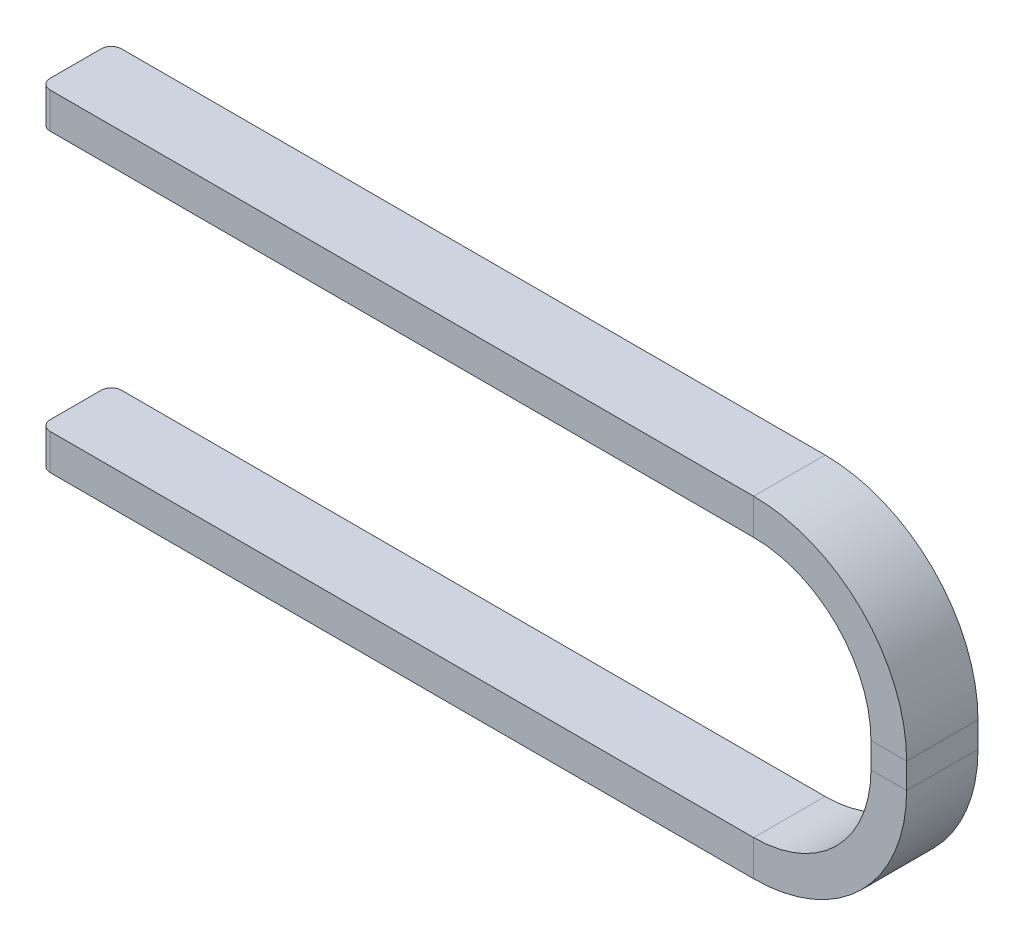
ISO-10303-21;
HEADER;
FILE_DESCRIPTION(('STEP AP214'),'2;1');
FILE_NAME('part.step','',(''),(''),'','','');
FILE_SCHEMA(('AUTOMOTIVE_DESIGN { 1 0 10303 214 1 1 1 1 }'));
ENDSEC;
DATA;
#1=APPLICATION_CONTEXT('core data for automotive mechanical design processes');
#2=APPLICATION_PROTOCOL_DEFINITION('international standard','automotive_design',2000,#1);
#3=PRODUCT_CONTEXT('',#1,'mechanical');
#4=PRODUCT('Part','Part','',(#3));
#5=PRODUCT_RELATED_PRODUCT_CATEGORY('part','',(#4));
#6=PRODUCT_DEFINITION_FORMATION('','',#4);
#7=PRODUCT_DEFINITION_CONTEXT('part definition',#1,'design');
#8=PRODUCT_DEFINITION('design','',#6,#7);
#9=PRODUCT_DEFINITION_SHAPE('','',#8);
#10=(LENGTH_UNIT() NAMED_UNIT(*) SI_UNIT(.MILLI.,.METRE.));
#11=(NAMED_UNIT(*) PLANE_ANGLE_UNIT() SI_UNIT($,.RADIAN.));
#12=(NAMED_UNIT(*) SI_UNIT($,.STERADIAN.) SOLID_ANGLE_UNIT());
#13=UNCERTAINTY_MEASURE_WITH_UNIT(LENGTH_MEASURE(1.E-05),#10,'distance_accuracy_value','');
#14=(GEOMETRIC_REPRESENTATION_CONTEXT(3) GLOBAL_UNCERTAINTY_ASSIGNED_CONTEXT((#13)) GLOBAL_UNIT_ASSIGNED_CONTEXT((#10,
#11,#12)) REPRESENTATION_CONTEXT('',''));
#15=CARTESIAN_POINT('',(0.,0.,0.));
#16=DIRECTION('',(0.,0.,1.));
#17=DIRECTION('',(1.,0.,0.));
#18=AXIS2_PLACEMENT_3D('',#15,#16,#17);
#19=CARTESIAN_POINT('',(17.,-3.00000000000002,1.4));
#20=DIRECTION('',(0.,0.,1.));
#21=DIRECTION('',(1.,0.,0.));
#22=AXIS2_PLACEMENT_3D('',#19,#20,#21);
#23=PLANE('',#22);
#24=DIRECTION('',(-1.,0.,0.));
#25=VECTOR('',#24,1.);
#26=CARTESIAN_POINT('',(17.,-3.00000000000002,1.4));
#27=LINE('',#26,#25);
#28=CARTESIAN_POINT('',(17.,-3.00000000000002,1.4));
#29=VERTEX_POINT('',#28);
#30=CARTESIAN_POINT('',(16.3,-3.00000000000002,1.4));
#31=VERTEX_POINT('',#30);
#32=EDGE_CURVE('E274',#29,#31,#27,.T.);
#33=ORIENTED_EDGE('',*,*,#32,.F.);
#34=CARTESIAN_POINT('',(14.,-3.,1.4));
#35=DIRECTION('',(0.,0.,-1.));
#36=DIRECTION('',(1.,0.,0.));
#37=AXIS2_PLACEMENT_3D('',#34,#35,#36);
#38=CIRCLE('',#37,3.);
#39=CARTESIAN_POINT('',(14.,0.,1.4));
#40=VERTEX_POINT('',#39);
#41=EDGE_CURVE('E193',#40,#29,#38,.T.);
#42=ORIENTED_EDGE('',*,*,#41,.F.);
#43=DIRECTION('',(0.,1.,0.));
#44=VECTOR('',#43,1.);
#45=CARTESIAN_POINT('',(14.,-0.700000000000001,1.4));
#46=LINE('',#45,#44);
#47=CARTESIAN_POINT('',(14.,-0.700000000000001,1.4));
#48=VERTEX_POINT('',#47);
#49=EDGE_CURVE('E271',#48,#40,#46,.T.);
#50=ORIENTED_EDGE('',*,*,#49,.F.);
#51=CARTESIAN_POINT('',(14.,-3.,1.4));
#52=DIRECTION('',(0.,0.,1.));
#53=DIRECTION('',(1.,0.,0.));
#54=AXIS2_PLACEMENT_3D('',#51,#52,#53);
#55=CIRCLE('',#54,2.3);
#56=EDGE_CURVE('E203',#48,#31,#55,.F.);
#57=ORIENTED_EDGE('',*,*,#56,.T.);
#58=EDGE_LOOP('',(#33,#42,#50,#57));
#59=FACE_BOUND('',#58,.T.);
#60=ADVANCED_FACE('F37',(#59),#23,.T.);
#61=CARTESIAN_POINT('',(14.,-0.700000000000001,1.4));
#62=DIRECTION('',(0.,0.,1.));
#63=DIRECTION('',(1.,0.,0.));
#64=AXIS2_PLACEMENT_3D('',#61,#62,#63);
#65=PLANE('',#64);
#66=DIRECTION('',(0.,-1.,0.));
#67=VECTOR('',#66,1.);
#68=CARTESIAN_POINT('',(17.,-3.00000000000002,1.4));
#69=LINE('',#68,#67);
#70=CARTESIAN_POINT('',(17.,-3.49999999999998,1.4));
#71=VERTEX_POINT('',#70);
#72=EDGE_CURVE('E191',#29,#71,#69,.T.);
#73=ORIENTED_EDGE('',*,*,#72,.F.);
#74=ORIENTED_EDGE('',*,*,#32,.T.);
#75=DIRECTION('',(0.,1.,0.));
#76=VECTOR('',#75,1.);
#77=CARTESIAN_POINT('',(16.3,-3.00000000000002,1.4));
#78=LINE('',#77,#76);
#79=CARTESIAN_POINT('',(16.3,-3.49999999999998,1.4));
#80=VERTEX_POINT('',#79);
#81=EDGE_CURVE('E206',#31,#80,#78,.F.);
#82=ORIENTED_EDGE('',*,*,#81,.T.);
#83=DIRECTION('',(1.,0.,0.));
#84=VECTOR('',#83,1.);
#85=CARTESIAN_POINT('',(16.3,-3.49999999999998,1.4));
#86=LINE('',#85,#84);
#87=EDGE_CURVE('E164',#80,#71,#86,.T.);
#88=ORIENTED_EDGE('',*,*,#87,.T.);
#89=EDGE_LOOP('',(#73,#74,#82,#88));
#90=FACE_BOUND('',#89,.T.);
#91=ADVANCED_FACE('F340',(#90),#65,.T.);
#92=CARTESIAN_POINT('',(14.,0.,0.));
#93=DIRECTION('',(0.,0.,-1.));
#94=DIRECTION('',(-1.,0.,0.));
#95=AXIS2_PLACEMENT_3D('',#92,#93,#94);
#96=PLANE('',#95);
#97=DIRECTION('',(0.,-1.,0.));
#98=VECTOR('',#97,1.);
#99=CARTESIAN_POINT('',(14.,0.,0.));
#100=LINE('',#99,#98);
#101=CARTESIAN_POINT('',(14.,0.,0.));
#102=VERTEX_POINT('',#101);
#103=CARTESIAN_POINT('',(14.,-0.700000000000001,0.));
#104=VERTEX_POINT('',#103);
#105=EDGE_CURVE('E268',#102,#104,#100,.T.);
#106=ORIENTED_EDGE('',*,*,#105,.F.);
#107=CARTESIAN_POINT('',(14.,-3.,0.));
#108=DIRECTION('',(0.,0.,-1.));
#109=DIRECTION('',(1.,0.,0.));
#110=AXIS2_PLACEMENT_3D('',#107,#108,#109);
#111=CIRCLE('',#110,3.);
#112=CARTESIAN_POINT('',(17.,-3.00000000000002,0.));
#113=VERTEX_POINT('',#112);
#114=EDGE_CURVE('E220',#102,#113,#111,.T.);
#115=ORIENTED_EDGE('',*,*,#114,.T.);
#116=DIRECTION('',(1.,0.,0.));
#117=VECTOR('',#116,1.);
#118=CARTESIAN_POINT('',(16.3,-3.00000000000002,0.));
#119=LINE('',#118,#117);
#120=CARTESIAN_POINT('',(16.3,-3.00000000000002,0.));
#121=VERTEX_POINT('',#120);
#122=EDGE_CURVE('E163',#121,#113,#119,.T.);
#123=ORIENTED_EDGE('',*,*,#122,.F.);
#124=CARTESIAN_POINT('',(14.,-3.,0.));
#125=DIRECTION('',(0.,0.,1.));
#126=DIRECTION('',(1.,0.,0.));
#127=AXIS2_PLACEMENT_3D('',#124,#125,#126);
#128=CIRCLE('',#127,2.3);
#129=EDGE_CURVE('E227',#104,#121,#128,.F.);
#130=ORIENTED_EDGE('',*,*,#129,.F.);
#131=EDGE_LOOP('',(#106,#115,#123,#130));
#132=FACE_BOUND('',#131,.T.);
#133=ADVANCED_FACE('F373',(#132),#96,.T.);
#134=CARTESIAN_POINT('',(16.3,-3.00000000000002,0.));
#135=DIRECTION('',(0.,0.,-1.));
#136=DIRECTION('',(-1.,0.,0.));
#137=AXIS2_PLACEMENT_3D('',#134,#135,#136);
#138=PLANE('',#137);
#139=DIRECTION('',(1.,0.,0.));
#140=VECTOR('',#139,1.);
#141=CARTESIAN_POINT('',(0.,-0.7,0.));
#142=LINE('',#141,#140);
#143=CARTESIAN_POINT('',(0.199999999999999,-0.7,0.));
#144=VERTEX_POINT('',#143);
#145=EDGE_CURVE('E225',#144,#104,#142,.T.);
#146=ORIENTED_EDGE('',*,*,#145,.F.);
#147=DIRECTION('',(0.,1.,0.));
#148=VECTOR('',#147,1.);
#149=CARTESIAN_POINT('',(0.199999999999999,-3.00000000000002,0.));
#150=LINE('',#149,#148);
#151=CARTESIAN_POINT('',(0.199999999999999,0.,0.));
#152=VERTEX_POINT('',#151);
#153=EDGE_CURVE('E293',#144,#152,#150,.T.);
#154=ORIENTED_EDGE('',*,*,#153,.T.);
#155=DIRECTION('',(1.,0.,0.));
#156=VECTOR('',#155,1.);
#157=CARTESIAN_POINT('',(0.,0.,0.));
#158=LINE('',#157,#156);
#159=EDGE_CURVE('E223',#152,#102,#158,.T.);
#160=ORIENTED_EDGE('',*,*,#159,.T.);
#161=ORIENTED_EDGE('',*,*,#105,.T.);
#162=EDGE_LOOP('',(#146,#154,#160,#161));
#163=FACE_BOUND('',#162,.T.);
#164=ADVANCED_FACE('F313',(#163),#138,.T.);
#165=CARTESIAN_POINT('',(14.,-6.5,1.4));
#166=DIRECTION('',(0.,0.,1.));
#167=DIRECTION('',(1.,0.,0.));
#168=AXIS2_PLACEMENT_3D('',#165,#166,#167);
#169=PLANE('',#168);
#170=DIRECTION('',(0.,1.,0.));
#171=VECTOR('',#170,1.);
#172=CARTESIAN_POINT('',(14.,-6.5,1.4));
#173=LINE('',#172,#171);
#174=CARTESIAN_POINT('',(14.,-6.5,1.4));
#175=VERTEX_POINT('',#174);
#176=CARTESIAN_POINT('',(14.,-5.8,1.4));
#177=VERTEX_POINT('',#176);
#178=EDGE_CURVE('E151',#175,#177,#173,.T.);
#179=ORIENTED_EDGE('',*,*,#178,.F.);
#180=CARTESIAN_POINT('',(14.,-3.5,1.4));
#181=DIRECTION('',(0.,0.,-1.));
#182=DIRECTION('',(1.,0.,0.));
#183=AXIS2_PLACEMENT_3D('',#180,#181,#182);
#184=CIRCLE('',#183,3.);
#185=EDGE_CURVE('E155',#71,#175,#184,.T.);
#186=ORIENTED_EDGE('',*,*,#185,.F.);
#187=ORIENTED_EDGE('',*,*,#87,.F.);
#188=CARTESIAN_POINT('',(14.,-3.5,1.4));
#189=DIRECTION('',(0.,0.,1.));
#190=DIRECTION('',(1.,0.,0.));
#191=AXIS2_PLACEMENT_3D('',#188,#189,#190);
#192=CIRCLE('',#191,2.3);
#193=EDGE_CURVE('E158',#80,#177,#192,.F.);
#194=ORIENTED_EDGE('',*,*,#193,.T.);
#195=EDGE_LOOP('',(#179,#186,#187,#194));
#196=FACE_BOUND('',#195,.T.);
#197=ADVANCED_FACE('F153',(#196),#169,.T.);
#198=CARTESIAN_POINT('',(16.3,-3.49999999999998,1.4));
#199=DIRECTION('',(0.,0.,1.));
#200=DIRECTION('',(1.,0.,0.));
#201=AXIS2_PLACEMENT_3D('',#198,#199,#200);
#202=PLANE('',#201);
#203=DIRECTION('',(-1.,0.,0.));
#204=VECTOR('',#203,1.);
#205=CARTESIAN_POINT('',(14.,-5.8,1.4));
#206=LINE('',#205,#204);
#207=CARTESIAN_POINT('',(0.200000000000001,-5.8,1.4));
#208=VERTEX_POINT('',#207);
#209=EDGE_CURVE('E186',#177,#208,#206,.T.);
#210=ORIENTED_EDGE('',*,*,#209,.T.);
#211=DIRECTION('',(0.,1.,0.));
#212=VECTOR('',#211,1.);
#213=CARTESIAN_POINT('',(0.199999999999999,-3.49999999999998,1.4));
#214=LINE('',#213,#212);
#215=CARTESIAN_POINT('',(0.200000000000001,-6.5,1.4));
#216=VERTEX_POINT('',#215);
#217=EDGE_CURVE('E185',#208,#216,#214,.F.);
#218=ORIENTED_EDGE('',*,*,#217,.T.);
#219=DIRECTION('',(-1.,0.,0.));
#220=VECTOR('',#219,1.);
#221=CARTESIAN_POINT('',(14.,-6.5,1.4));
#222=LINE('',#221,#220);
#223=EDGE_CURVE('E173',#175,#216,#222,.T.);
#224=ORIENTED_EDGE('',*,*,#223,.F.);
#225=ORIENTED_EDGE('',*,*,#178,.T.);
#226=EDGE_LOOP('',(#210,#218,#224,#225));
#227=FACE_BOUND('',#226,.T.);
#228=ADVANCED_FACE('F183',(#227),#202,.T.);
#229=CARTESIAN_POINT('',(17.,-3.49999999999998,0.));
#230=DIRECTION('',(0.,0.,-1.));
#231=DIRECTION('',(-1.,0.,0.));
#232=AXIS2_PLACEMENT_3D('',#229,#230,#231);
#233=PLANE('',#232);
#234=DIRECTION('',(-1.,0.,0.));
#235=VECTOR('',#234,1.);
#236=CARTESIAN_POINT('',(17.,-3.49999999999998,0.));
#237=LINE('',#236,#235);
#238=CARTESIAN_POINT('',(17.,-3.49999999999998,0.));
#239=VERTEX_POINT('',#238);
#240=CARTESIAN_POINT('',(16.3,-3.49999999999998,0.));
#241=VERTEX_POINT('',#240);
#242=EDGE_CURVE('E264',#239,#241,#237,.T.);
#243=ORIENTED_EDGE('',*,*,#242,.F.);
#244=CARTESIAN_POINT('',(14.,-3.5,0.));
#245=DIRECTION('',(0.,0.,-1.));
#246=DIRECTION('',(1.,0.,0.));
#247=AXIS2_PLACEMENT_3D('',#244,#245,#246);
#248=CIRCLE('',#247,3.);
#249=CARTESIAN_POINT('',(14.,-6.5,0.));
#250=VERTEX_POINT('',#249);
#251=EDGE_CURVE('E215',#239,#250,#248,.T.);
#252=ORIENTED_EDGE('',*,*,#251,.T.);
#253=DIRECTION('',(0.,-1.,0.));
#254=VECTOR('',#253,1.);
#255=CARTESIAN_POINT('',(14.,-5.8,0.));
#256=LINE('',#255,#254);
#257=CARTESIAN_POINT('',(14.,-5.8,0.));
#258=VERTEX_POINT('',#257);
#259=EDGE_CURVE('E262',#258,#250,#256,.T.);
#260=ORIENTED_EDGE('',*,*,#259,.F.);
#261=CARTESIAN_POINT('',(14.,-3.5,0.));
#262=DIRECTION('',(0.,0.,1.));
#263=DIRECTION('',(1.,0.,0.));
#264=AXIS2_PLACEMENT_3D('',#261,#262,#263);
#265=CIRCLE('',#264,2.3);
#266=EDGE_CURVE('E233',#241,#258,#265,.F.);
#267=ORIENTED_EDGE('',*,*,#266,.F.);
#268=EDGE_LOOP('',(#243,#252,#260,#267));
#269=FACE_BOUND('',#268,.T.);
#270=ADVANCED_FACE('F368',(#269),#233,.T.);
#271=CARTESIAN_POINT('',(14.,-5.8,0.));
#272=DIRECTION('',(0.,0.,-1.));
#273=DIRECTION('',(-1.,0.,0.));
#274=AXIS2_PLACEMENT_3D('',#271,#272,#273);
#275=PLANE('',#274);
#276=DIRECTION('',(0.,-1.,0.));
#277=VECTOR('',#276,1.);
#278=CARTESIAN_POINT('',(17.,-3.00000000000002,0.));
#279=LINE('',#278,#277);
#280=EDGE_CURVE('E217',#113,#239,#279,.T.);
#281=ORIENTED_EDGE('',*,*,#280,.T.);
#282=ORIENTED_EDGE('',*,*,#242,.T.);
#283=DIRECTION('',(0.,1.,0.));
#284=VECTOR('',#283,1.);
#285=CARTESIAN_POINT('',(16.3,-3.00000000000002,0.));
#286=LINE('',#285,#284);
#287=EDGE_CURVE('E230',#121,#241,#286,.F.);
#288=ORIENTED_EDGE('',*,*,#287,.F.);
#289=ORIENTED_EDGE('',*,*,#122,.T.);
#290=EDGE_LOOP('',(#281,#282,#288,#289));
#291=FACE_BOUND('',#290,.T.);
#292=ADVANCED_FACE('F370',(#291),#275,.T.);
#293=CARTESIAN_POINT('',(14.,-5.8,1.4));
#294=DIRECTION('',(0.,-1.,0.));
#295=DIRECTION('',(1.,0.,0.));
#296=AXIS2_PLACEMENT_3D('',#293,#294,#295);
#297=PLANE('',#296);
#298=DIRECTION('',(-1.,0.,0.));
#299=VECTOR('',#298,1.);
#300=CARTESIAN_POINT('',(14.,-5.8,0.));
#301=LINE('',#300,#299);
#302=CARTESIAN_POINT('',(0.200000000000001,-5.8,0.));
#303=VERTEX_POINT('',#302);
#304=EDGE_CURVE('E211',#258,#303,#301,.T.);
#305=ORIENTED_EDGE('',*,*,#304,.T.);
#306=CARTESIAN_POINT('',(0.200000000000001,-5.8,0.2));
#307=DIRECTION('',(0.,-1.,0.));
#308=DIRECTION('',(1.,0.,0.));
#309=AXIS2_PLACEMENT_3D('',#306,#307,#308);
#310=CIRCLE('',#309,0.2);
#311=CARTESIAN_POINT('',(0.,-5.8,0.2));
#312=VERTEX_POINT('',#311);
#313=EDGE_CURVE('E281',#303,#312,#310,.F.);
#314=ORIENTED_EDGE('',*,*,#313,.T.);
#315=DIRECTION('',(0.,0.,-1.));
#316=VECTOR('',#315,1.);
#317=CARTESIAN_POINT('',(0.,-5.8,1.4));
#318=LINE('',#317,#316);
#319=CARTESIAN_POINT('',(0.,-5.8,1.2));
#320=VERTEX_POINT('',#319);
#321=EDGE_CURVE('E259',#320,#312,#318,.T.);
#322=ORIENTED_EDGE('',*,*,#321,.F.);
#323=CARTESIAN_POINT('',(0.2,-5.8,1.2));
#324=DIRECTION('',(0.,-1.,0.));
#325=DIRECTION('',(1.,0.,0.));
#326=AXIS2_PLACEMENT_3D('',#323,#324,#325);
#327=CIRCLE('',#326,0.2);
#328=EDGE_CURVE('E279',#320,#208,#327,.F.);
#329=ORIENTED_EDGE('',*,*,#328,.T.);
#330=ORIENTED_EDGE('',*,*,#209,.F.);
#331=DIRECTION('',(0.,0.,-1.));
#332=VECTOR('',#331,1.);
#333=CARTESIAN_POINT('',(14.,-5.8,1.4));
#334=LINE('',#333,#332);
#335=EDGE_CURVE('E210',#177,#258,#334,.T.);
#336=ORIENTED_EDGE('',*,*,#335,.T.);
#337=EDGE_LOOP('',(#305,#314,#322,#329,#330,#336));
#338=FACE_BOUND('',#337,.T.);
#339=ADVANCED_FACE('F352',(#338),#297,.F.);
#340=CARTESIAN_POINT('',(0.,-6.5,1.4));
#341=DIRECTION('',(-1.,0.,0.));
#342=DIRECTION('',(0.,0.,1.));
#343=AXIS2_PLACEMENT_3D('',#340,#341,#342);
#344=PLANE('',#343);
#345=ORIENTED_EDGE('',*,*,#321,.T.);
#346=DIRECTION('',(0.,1.,0.));
#347=VECTOR('',#346,1.);
#348=CARTESIAN_POINT('',(0.,-6.5,0.2));
#349=LINE('',#348,#347);
#350=CARTESIAN_POINT('',(0.,-6.5,0.2));
#351=VERTEX_POINT('',#350);
#352=EDGE_CURVE('E286',#312,#351,#349,.F.);
#353=ORIENTED_EDGE('',*,*,#352,.T.);
#354=DIRECTION('',(0.,0.,-1.));
#355=VECTOR('',#354,1.);
#356=CARTESIAN_POINT('',(0.,-6.5,1.4));
#357=LINE('',#356,#355);
#358=CARTESIAN_POINT('',(0.,-6.5,1.2));
#359=VERTEX_POINT('',#358);
#360=EDGE_CURVE('E180',#359,#351,#357,.T.);
#361=ORIENTED_EDGE('',*,*,#360,.F.);
#362=DIRECTION('',(0.,1.,0.));
#363=VECTOR('',#362,1.);
#364=CARTESIAN_POINT('',(0.,-6.5,1.2));
#365=LINE('',#364,#363);
#366=EDGE_CURVE('E283',#359,#320,#365,.T.);
#367=ORIENTED_EDGE('',*,*,#366,.T.);
#368=EDGE_LOOP('',(#345,#353,#361,#367));
#369=FACE_BOUND('',#368,.T.);
#370=ADVANCED_FACE('F360',(#369),#344,.T.);
#371=CARTESIAN_POINT('',(14.,-6.5,1.4));
#372=DIRECTION('',(0.,-1.,0.));
#373=DIRECTION('',(1.,0.,0.));
#374=AXIS2_PLACEMENT_3D('',#371,#372,#373);
#375=PLANE('',#374);
#376=ORIENTED_EDGE('',*,*,#360,.T.);
#377=CARTESIAN_POINT('',(0.200000000000001,-6.5,0.2));
#378=DIRECTION('',(0.,-1.,0.));
#379=DIRECTION('',(1.,0.,0.));
#380=AXIS2_PLACEMENT_3D('',#377,#378,#379);
#381=CIRCLE('',#380,0.2);
#382=CARTESIAN_POINT('',(0.200000000000001,-6.5,0.));
#383=VERTEX_POINT('',#382);
#384=EDGE_CURVE('E290',#351,#383,#381,.T.);
#385=ORIENTED_EDGE('',*,*,#384,.T.);
#386=DIRECTION('',(-1.,0.,0.));
#387=VECTOR('',#386,1.);
#388=CARTESIAN_POINT('',(14.,-6.5,0.));
#389=LINE('',#388,#387);
#390=EDGE_CURVE('E176',#250,#383,#389,.T.);
#391=ORIENTED_EDGE('',*,*,#390,.F.);
#392=DIRECTION('',(0.,0.,-1.));
#393=VECTOR('',#392,1.);
#394=CARTESIAN_POINT('',(14.,-6.5,1.4));
#395=LINE('',#394,#393);
#396=EDGE_CURVE('E170',#175,#250,#395,.T.);
#397=ORIENTED_EDGE('',*,*,#396,.F.);
#398=ORIENTED_EDGE('',*,*,#223,.T.);
#399=CARTESIAN_POINT('',(0.2,-6.5,1.2));
#400=DIRECTION('',(0.,-1.,0.));
#401=DIRECTION('',(1.,0.,0.));
#402=AXIS2_PLACEMENT_3D('',#399,#400,#401);
#403=CIRCLE('',#402,0.2);
#404=EDGE_CURVE('E288',#216,#359,#403,.T.);
#405=ORIENTED_EDGE('',*,*,#404,.T.);
#406=EDGE_LOOP('',(#376,#385,#391,#397,#398,#405));
#407=FACE_BOUND('',#406,.T.);
#408=ADVANCED_FACE('F172',(#407),#375,.T.);
#409=CARTESIAN_POINT('',(14.,-3.5,1.4));
#410=DIRECTION('',(0.,0.,-1.));
#411=DIRECTION('',(-1.,0.,0.));
#412=AXIS2_PLACEMENT_3D('',#409,#410,#411);
#413=CYLINDRICAL_SURFACE('',#412,3.);
#414=ORIENTED_EDGE('',*,*,#251,.F.);
#415=DIRECTION('',(0.,0.,-1.));
#416=VECTOR('',#415,1.);
#417=CARTESIAN_POINT('',(17.,-3.49999999999998,1.4));
#418=LINE('',#417,#416);
#419=EDGE_CURVE('E181',#71,#239,#418,.T.);
#420=ORIENTED_EDGE('',*,*,#419,.F.);
#421=ORIENTED_EDGE('',*,*,#185,.T.);
#422=ORIENTED_EDGE('',*,*,#396,.T.);
#423=EDGE_LOOP('',(#414,#420,#421,#422));
#424=FACE_BOUND('',#423,.T.);
#425=ADVANCED_FACE('F189',(#424),#413,.T.);
#426=CARTESIAN_POINT('',(17.,-3.00000000000002,1.4));
#427=DIRECTION('',(1.,0.,0.));
#428=DIRECTION('',(0.,0.,-1.));
#429=AXIS2_PLACEMENT_3D('',#426,#427,#428);
#430=PLANE('',#429);
#431=ORIENTED_EDGE('',*,*,#280,.F.);
#432=DIRECTION('',(0.,0.,-1.));
#433=VECTOR('',#432,1.);
#434=CARTESIAN_POINT('',(17.,-3.00000000000002,1.4));
#435=LINE('',#434,#433);
#436=EDGE_CURVE('E254',#29,#113,#435,.T.);
#437=ORIENTED_EDGE('',*,*,#436,.F.);
#438=ORIENTED_EDGE('',*,*,#72,.T.);
#439=ORIENTED_EDGE('',*,*,#419,.T.);
#440=EDGE_LOOP('',(#431,#437,#438,#439));
#441=FACE_BOUND('',#440,.T.);
#442=ADVANCED_FACE('F339',(#441),#430,.T.);
#443=CARTESIAN_POINT('',(14.,-3.,1.4));
#444=DIRECTION('',(0.,0.,-1.));
#445=DIRECTION('',(-1.,0.,0.));
#446=AXIS2_PLACEMENT_3D('',#443,#444,#445);
#447=CYLINDRICAL_SURFACE('',#446,3.);
#448=ORIENTED_EDGE('',*,*,#114,.F.);
#449=DIRECTION('',(0.,0.,-1.));
#450=VECTOR('',#449,1.);
#451=CARTESIAN_POINT('',(14.,0.,1.4));
#452=LINE('',#451,#450);
#453=EDGE_CURVE('E251',#40,#102,#452,.T.);
#454=ORIENTED_EDGE('',*,*,#453,.F.);
#455=ORIENTED_EDGE('',*,*,#41,.T.);
#456=ORIENTED_EDGE('',*,*,#436,.T.);
#457=EDGE_LOOP('',(#448,#454,#455,#456));
#458=FACE_BOUND('',#457,.T.);
#459=ADVANCED_FACE('F331',(#458),#447,.T.);
#460=CARTESIAN_POINT('',(0.,0.,1.4));
#461=DIRECTION('',(0.,1.,0.));
#462=DIRECTION('',(0.,0.,1.));
#463=AXIS2_PLACEMENT_3D('',#460,#461,#462);
#464=PLANE('',#463);
#465=ORIENTED_EDGE('',*,*,#159,.F.);
#466=CARTESIAN_POINT('',(0.199999999999999,0.,0.2));
#467=DIRECTION('',(0.,1.,0.));
#468=DIRECTION('',(0.,0.,1.));
#469=AXIS2_PLACEMENT_3D('',#466,#467,#468);
#470=CIRCLE('',#469,0.2);
#471=CARTESIAN_POINT('',(0.,0.,0.2));
#472=VERTEX_POINT('',#471);
#473=EDGE_CURVE('E298',#152,#472,#470,.T.);
#474=ORIENTED_EDGE('',*,*,#473,.T.);
#475=DIRECTION('',(0.,0.,-1.));
#476=VECTOR('',#475,1.);
#477=CARTESIAN_POINT('',(0.,0.,1.4));
#478=LINE('',#477,#476);
#479=CARTESIAN_POINT('',(0.,0.,1.2));
#480=VERTEX_POINT('',#479);
#481=EDGE_CURVE('E249',#480,#472,#478,.T.);
#482=ORIENTED_EDGE('',*,*,#481,.F.);
#483=CARTESIAN_POINT('',(0.2,0.,1.2));
#484=DIRECTION('',(0.,1.,0.));
#485=DIRECTION('',(0.,0.,1.));
#486=AXIS2_PLACEMENT_3D('',#483,#484,#485);
#487=CIRCLE('',#486,0.2);
#488=CARTESIAN_POINT('',(0.2,0.,1.4));
#489=VERTEX_POINT('',#488);
#490=EDGE_CURVE('E296',#480,#489,#487,.T.);
#491=ORIENTED_EDGE('',*,*,#490,.T.);
#492=DIRECTION('',(1.,0.,0.));
#493=VECTOR('',#492,1.);
#494=CARTESIAN_POINT('',(0.,0.,1.4));
#495=LINE('',#494,#493);
#496=EDGE_CURVE('E199',#489,#40,#495,.T.);
#497=ORIENTED_EDGE('',*,*,#496,.T.);
#498=ORIENTED_EDGE('',*,*,#453,.T.);
#499=EDGE_LOOP('',(#465,#474,#482,#491,#497,#498));
#500=FACE_BOUND('',#499,.T.);
#501=ADVANCED_FACE('F319',(#500),#464,.T.);
#502=CARTESIAN_POINT('',(0.,-0.7,1.4));
#503=DIRECTION('',(-1.,0.,0.));
#504=DIRECTION('',(0.,0.,1.));
#505=AXIS2_PLACEMENT_3D('',#502,#503,#504);
#506=PLANE('',#505);
#507=ORIENTED_EDGE('',*,*,#481,.T.);
#508=DIRECTION('',(0.,1.,0.));
#509=VECTOR('',#508,1.);
#510=CARTESIAN_POINT('',(0.,-0.7,0.2));
#511=LINE('',#510,#509);
#512=CARTESIAN_POINT('',(0.,-0.7,0.2));
#513=VERTEX_POINT('',#512);
#514=EDGE_CURVE('E58',#472,#513,#511,.F.);
#515=ORIENTED_EDGE('',*,*,#514,.T.);
#516=DIRECTION('',(0.,0.,-1.));
#517=VECTOR('',#516,1.);
#518=CARTESIAN_POINT('',(0.,-0.7,1.4));
#519=LINE('',#518,#517);
#520=CARTESIAN_POINT('',(0.,-0.7,1.2));
#521=VERTEX_POINT('',#520);
#522=EDGE_CURVE('E247',#521,#513,#519,.T.);
#523=ORIENTED_EDGE('',*,*,#522,.F.);
#524=DIRECTION('',(0.,1.,0.));
#525=VECTOR('',#524,1.);
#526=CARTESIAN_POINT('',(0.,0.,1.2));
#527=LINE('',#526,#525);
#528=EDGE_CURVE('E300',#521,#480,#527,.T.);
#529=ORIENTED_EDGE('',*,*,#528,.T.);
#530=EDGE_LOOP('',(#507,#515,#523,#529));
#531=FACE_BOUND('',#530,.T.);
#532=ADVANCED_FACE('F320',(#531),#506,.T.);
#533=CARTESIAN_POINT('',(0.,-0.7,1.4));
#534=DIRECTION('',(0.,1.,0.));
#535=DIRECTION('',(0.,0.,1.));
#536=AXIS2_PLACEMENT_3D('',#533,#534,#535);
#537=PLANE('',#536);
#538=ORIENTED_EDGE('',*,*,#522,.T.);
#539=CARTESIAN_POINT('',(0.199999999999999,-0.7,0.2));
#540=DIRECTION('',(0.,1.,0.));
#541=DIRECTION('',(0.,0.,1.));
#542=AXIS2_PLACEMENT_3D('',#539,#540,#541);
#543=CIRCLE('',#542,0.2);
#544=EDGE_CURVE('E45',#513,#144,#543,.F.);
#545=ORIENTED_EDGE('',*,*,#544,.T.);
#546=ORIENTED_EDGE('',*,*,#145,.T.);
#547=DIRECTION('',(0.,0.,-1.));
#548=VECTOR('',#547,1.);
#549=CARTESIAN_POINT('',(14.,-0.700000000000001,1.4));
#550=LINE('',#549,#548);
#551=EDGE_CURVE('E244',#48,#104,#550,.T.);
#552=ORIENTED_EDGE('',*,*,#551,.F.);
#553=DIRECTION('',(1.,0.,0.));
#554=VECTOR('',#553,1.);
#555=CARTESIAN_POINT('',(0.,-0.7,1.4));
#556=LINE('',#555,#554);
#557=CARTESIAN_POINT('',(0.2,-0.7,1.4));
#558=VERTEX_POINT('',#557);
#559=EDGE_CURVE('E201',#558,#48,#556,.T.);
#560=ORIENTED_EDGE('',*,*,#559,.F.);
#561=CARTESIAN_POINT('',(0.2,-0.7,1.2));
#562=DIRECTION('',(0.,1.,0.));
#563=DIRECTION('',(0.,0.,1.));
#564=AXIS2_PLACEMENT_3D('',#561,#562,#563);
#565=CIRCLE('',#564,0.2);
#566=EDGE_CURVE('E304',#558,#521,#565,.F.);
#567=ORIENTED_EDGE('',*,*,#566,.T.);
#568=EDGE_LOOP('',(#538,#545,#546,#552,#560,#567));
#569=FACE_BOUND('',#568,.T.);
#570=ADVANCED_FACE('F308',(#569),#537,.F.);
#571=CARTESIAN_POINT('',(14.,-3.,1.4));
#572=DIRECTION('',(0.,0.,-1.));
#573=DIRECTION('',(-1.,0.,0.));
#574=AXIS2_PLACEMENT_3D('',#571,#572,#573);
#575=CYLINDRICAL_SURFACE('',#574,2.3);
#576=ORIENTED_EDGE('',*,*,#129,.T.);
#577=DIRECTION('',(0.,0.,-1.));
#578=VECTOR('',#577,1.);
#579=CARTESIAN_POINT('',(16.3,-3.00000000000002,1.4));
#580=LINE('',#579,#578);
#581=EDGE_CURVE('E241',#31,#121,#580,.T.);
#582=ORIENTED_EDGE('',*,*,#581,.F.);
#583=ORIENTED_EDGE('',*,*,#56,.F.);
#584=ORIENTED_EDGE('',*,*,#551,.T.);
#585=EDGE_LOOP('',(#576,#582,#583,#584));
#586=FACE_BOUND('',#585,.T.);
#587=ADVANCED_FACE('F375',(#586),#575,.F.);
#588=CARTESIAN_POINT('',(16.3,-3.00000000000002,1.4));
#589=DIRECTION('',(1.,0.,0.));
#590=DIRECTION('',(0.,0.,-1.));
#591=AXIS2_PLACEMENT_3D('',#588,#589,#590);
#592=PLANE('',#591);
#593=ORIENTED_EDGE('',*,*,#287,.T.);
#594=DIRECTION('',(0.,0.,-1.));
#595=VECTOR('',#594,1.);
#596=CARTESIAN_POINT('',(16.3,-3.49999999999998,1.4));
#597=LINE('',#596,#595);
#598=EDGE_CURVE('E238',#80,#241,#597,.T.);
#599=ORIENTED_EDGE('',*,*,#598,.F.);
#600=ORIENTED_EDGE('',*,*,#81,.F.);
#601=ORIENTED_EDGE('',*,*,#581,.T.);
#602=EDGE_LOOP('',(#593,#599,#600,#601));
#603=FACE_BOUND('',#602,.T.);
#604=ADVANCED_FACE('F344',(#603),#592,.F.);
#605=CARTESIAN_POINT('',(14.,-3.5,1.4));
#606=DIRECTION('',(0.,0.,-1.));
#607=DIRECTION('',(-1.,0.,0.));
#608=AXIS2_PLACEMENT_3D('',#605,#606,#607);
#609=CYLINDRICAL_SURFACE('',#608,2.3);
#610=ORIENTED_EDGE('',*,*,#266,.T.);
#611=ORIENTED_EDGE('',*,*,#335,.F.);
#612=ORIENTED_EDGE('',*,*,#193,.F.);
#613=ORIENTED_EDGE('',*,*,#598,.T.);
#614=EDGE_LOOP('',(#610,#611,#612,#613));
#615=FACE_BOUND('',#614,.T.);
#616=ADVANCED_FACE('F348',(#615),#609,.F.);
#617=CARTESIAN_POINT('',(14.,-3.5,1.4));
#618=DIRECTION('',(0.,0.,-1.));
#619=DIRECTION('',(-1.,0.,0.));
#620=AXIS2_PLACEMENT_3D('',#617,#618,#619);
#621=PLANE('',#620);
#622=ORIENTED_EDGE('',*,*,#496,.F.);
#623=DIRECTION('',(0.,1.,0.));
#624=VECTOR('',#623,1.);
#625=CARTESIAN_POINT('',(0.2,-0.7,1.4));
#626=LINE('',#625,#624);
#627=EDGE_CURVE('E11',#489,#558,#626,.F.);
#628=ORIENTED_EDGE('',*,*,#627,.T.);
#629=ORIENTED_EDGE('',*,*,#559,.T.);
#630=ORIENTED_EDGE('',*,*,#49,.T.);
#631=EDGE_LOOP('',(#622,#628,#629,#630));
#632=FACE_BOUND('',#631,.T.);
#633=ADVANCED_FACE('F324',(#632),#621,.F.);
#634=CARTESIAN_POINT('',(14.,-3.5,0.));
#635=DIRECTION('',(0.,0.,-1.));
#636=DIRECTION('',(-1.,0.,0.));
#637=AXIS2_PLACEMENT_3D('',#634,#635,#636);
#638=PLANE('',#637);
#639=ORIENTED_EDGE('',*,*,#390,.T.);
#640=DIRECTION('',(0.,1.,0.));
#641=VECTOR('',#640,1.);
#642=CARTESIAN_POINT('',(0.200000000000001,-3.5,0.));
#643=LINE('',#642,#641);
#644=EDGE_CURVE('E276',#383,#303,#643,.T.);
#645=ORIENTED_EDGE('',*,*,#644,.T.);
#646=ORIENTED_EDGE('',*,*,#304,.F.);
#647=ORIENTED_EDGE('',*,*,#259,.T.);
#648=EDGE_LOOP('',(#639,#645,#646,#647));
#649=FACE_BOUND('',#648,.T.);
#650=ADVANCED_FACE('F366',(#649),#638,.T.);
#651=CARTESIAN_POINT('',(0.200000000000001,-3.5,0.2));
#652=DIRECTION('',(0.,1.,0.));
#653=DIRECTION('',(0.,0.,1.));
#654=AXIS2_PLACEMENT_3D('',#651,#652,#653);
#655=CYLINDRICAL_SURFACE('',#654,0.2);
#656=ORIENTED_EDGE('',*,*,#384,.F.);
#657=ORIENTED_EDGE('',*,*,#352,.F.);
#658=ORIENTED_EDGE('',*,*,#313,.F.);
#659=ORIENTED_EDGE('',*,*,#644,.F.);
#660=EDGE_LOOP('',(#656,#657,#658,#659));
#661=FACE_BOUND('',#660,.T.);
#662=ADVANCED_FACE('F363',(#661),#655,.T.);
#663=CARTESIAN_POINT('',(0.2,-6.5,1.2));
#664=DIRECTION('',(0.,1.,0.));
#665=DIRECTION('',(0.,0.,1.));
#666=AXIS2_PLACEMENT_3D('',#663,#664,#665);
#667=CYLINDRICAL_SURFACE('',#666,0.2);
#668=ORIENTED_EDGE('',*,*,#404,.F.);
#669=ORIENTED_EDGE('',*,*,#217,.F.);
#670=ORIENTED_EDGE('',*,*,#328,.F.);
#671=ORIENTED_EDGE('',*,*,#366,.F.);
#672=EDGE_LOOP('',(#668,#669,#670,#671));
#673=FACE_BOUND('',#672,.T.);
#674=ADVANCED_FACE('F355',(#673),#667,.T.);
#675=CARTESIAN_POINT('',(0.199999999999999,-3.00000000000002,0.2));
#676=DIRECTION('',(0.,1.,0.));
#677=DIRECTION('',(0.,0.,1.));
#678=AXIS2_PLACEMENT_3D('',#675,#676,#677);
#679=CYLINDRICAL_SURFACE('',#678,0.2);
#680=ORIENTED_EDGE('',*,*,#544,.F.);
#681=ORIENTED_EDGE('',*,*,#514,.F.);
#682=ORIENTED_EDGE('',*,*,#473,.F.);
#683=ORIENTED_EDGE('',*,*,#153,.F.);
#684=EDGE_LOOP('',(#680,#681,#682,#683));
#685=FACE_BOUND('',#684,.T.);
#686=ADVANCED_FACE('F316',(#685),#679,.T.);
#687=CARTESIAN_POINT('',(0.2,-0.7,1.2));
#688=DIRECTION('',(0.,-1.,0.));
#689=DIRECTION('',(0.,0.,-1.));
#690=AXIS2_PLACEMENT_3D('',#687,#688,#689);
#691=CYLINDRICAL_SURFACE('',#690,0.2);
#692=ORIENTED_EDGE('',*,*,#566,.F.);
#693=ORIENTED_EDGE('',*,*,#627,.F.);
#694=ORIENTED_EDGE('',*,*,#490,.F.);
#695=ORIENTED_EDGE('',*,*,#528,.F.);
#696=EDGE_LOOP('',(#692,#693,#694,#695));
#697=FACE_BOUND('',#696,.T.);
#698=ADVANCED_FACE('F39',(#697),#691,.T.);
#699=CLOSED_SHELL('',(#60,#91,#133,#164,#197,#228,#270,#292,#339,#370,#408,#425,#442,#459,#501,
#532,#570,#587,#604,#616,#633,#650,#662,#674,#686,#698));
#700=MANIFOLD_SOLID_BREP('B2',#699);
#701=ADVANCED_BREP_SHAPE_REPRESENTATION('',(#18,#700),#14);
#702=SHAPE_DEFINITION_REPRESENTATION(#9,#701);
ENDSEC;
END-ISO-10303-21;
